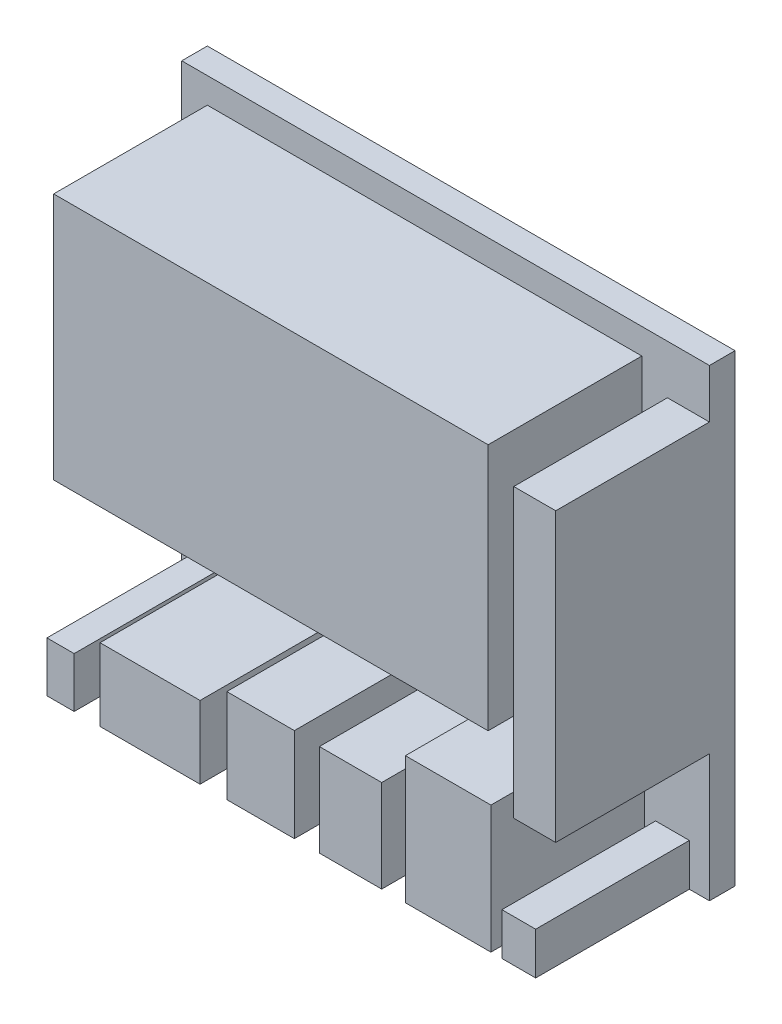
ISO-10303-21;
HEADER;
FILE_DESCRIPTION(('STEP AP214'),'2;1');
FILE_NAME('part.step','',(''),(''),'','','');
FILE_SCHEMA(('AUTOMOTIVE_DESIGN { 1 0 10303 214 1 1 1 1 }'));
ENDSEC;
DATA;
#1=APPLICATION_CONTEXT('core data for automotive mechanical design processes');
#2=APPLICATION_PROTOCOL_DEFINITION('international standard','automotive_design',2000,#1);
#3=PRODUCT_CONTEXT('',#1,'mechanical');
#4=PRODUCT('Part','Part','',(#3));
#5=PRODUCT_RELATED_PRODUCT_CATEGORY('part','',(#4));
#6=PRODUCT_DEFINITION_FORMATION('','',#4);
#7=PRODUCT_DEFINITION_CONTEXT('part definition',#1,'design');
#8=PRODUCT_DEFINITION('design','',#6,#7);
#9=PRODUCT_DEFINITION_SHAPE('','',#8);
#10=(LENGTH_UNIT() NAMED_UNIT(*) SI_UNIT(.MILLI.,.METRE.));
#11=(NAMED_UNIT(*) PLANE_ANGLE_UNIT() SI_UNIT($,.RADIAN.));
#12=(NAMED_UNIT(*) SI_UNIT($,.STERADIAN.) SOLID_ANGLE_UNIT());
#13=UNCERTAINTY_MEASURE_WITH_UNIT(LENGTH_MEASURE(1.E-05),#10,'distance_accuracy_value','');
#14=(GEOMETRIC_REPRESENTATION_CONTEXT(3) GLOBAL_UNCERTAINTY_ASSIGNED_CONTEXT((#13)) GLOBAL_UNIT_ASSIGNED_CONTEXT((#10,
#11,#12)) REPRESENTATION_CONTEXT('',''));
#15=CARTESIAN_POINT('',(0.,0.,0.));
#16=DIRECTION('',(0.,0.,1.));
#17=DIRECTION('',(1.,0.,0.));
#18=AXIS2_PLACEMENT_3D('',#15,#16,#17);
#19=CARTESIAN_POINT('',(0.,0.,35.));
#20=DIRECTION('',(1.,0.,0.));
#21=DIRECTION('',(0.,0.,-1.));
#22=AXIS2_PLACEMENT_3D('',#19,#20,#21);
#23=PLANE('',#22);
#24=DIRECTION('',(0.,-1.,0.));
#25=VECTOR('',#24,1.);
#26=CARTESIAN_POINT('',(0.,32.1447308661449,5.));
#27=LINE('',#26,#25);
#28=CARTESIAN_POINT('',(0.,90.5,5.));
#29=VERTEX_POINT('',#28);
#30=CARTESIAN_POINT('',(0.,0.,5.));
#31=VERTEX_POINT('',#30);
#32=EDGE_CURVE('E415',#29,#31,#27,.T.);
#33=ORIENTED_EDGE('',*,*,#32,.F.);
#34=DIRECTION('',(0.,0.,-1.));
#35=VECTOR('',#34,1.);
#36=CARTESIAN_POINT('',(0.,90.5,35.));
#37=LINE('',#36,#35);
#38=CARTESIAN_POINT('',(0.,90.5,0.));
#39=VERTEX_POINT('',#38);
#40=EDGE_CURVE('E534',#29,#39,#37,.T.);
#41=ORIENTED_EDGE('',*,*,#40,.T.);
#42=DIRECTION('',(0.,-1.,0.));
#43=VECTOR('',#42,1.);
#44=CARTESIAN_POINT('',(0.,0.,0.));
#45=LINE('',#44,#43);
#46=CARTESIAN_POINT('',(0.,0.,0.));
#47=VERTEX_POINT('',#46);
#48=EDGE_CURVE('E469',#39,#47,#45,.T.);
#49=ORIENTED_EDGE('',*,*,#48,.T.);
#50=DIRECTION('',(0.,0.,-1.));
#51=VECTOR('',#50,1.);
#52=CARTESIAN_POINT('',(0.,0.,35.));
#53=LINE('',#52,#51);
#54=EDGE_CURVE('E11',#31,#47,#53,.T.);
#55=ORIENTED_EDGE('',*,*,#54,.F.);
#56=EDGE_LOOP('',(#33,#41,#49,#55));
#57=FACE_BOUND('',#56,.T.);
#58=ADVANCED_FACE('F43',(#57),#23,.F.);
#59=CARTESIAN_POINT('',(0.,90.5,35.));
#60=DIRECTION('',(0.,-1.,0.));
#61=DIRECTION('',(0.,0.,-1.));
#62=AXIS2_PLACEMENT_3D('',#59,#60,#61);
#63=PLANE('',#62);
#64=DIRECTION('',(-1.,0.,0.));
#65=VECTOR('',#64,1.);
#66=CARTESIAN_POINT('',(103.,90.5,5.));
#67=LINE('',#66,#65);
#68=CARTESIAN_POINT('',(103.,90.5,5.));
#69=VERTEX_POINT('',#68);
#70=EDGE_CURVE('E316',#69,#29,#67,.T.);
#71=ORIENTED_EDGE('',*,*,#70,.F.);
#72=DIRECTION('',(0.,0.,-1.));
#73=VECTOR('',#72,1.);
#74=CARTESIAN_POINT('',(103.,90.5,35.));
#75=LINE('',#74,#73);
#76=CARTESIAN_POINT('',(103.,90.5,0.));
#77=VERTEX_POINT('',#76);
#78=EDGE_CURVE('E546',#69,#77,#75,.T.);
#79=ORIENTED_EDGE('',*,*,#78,.T.);
#80=DIRECTION('',(-1.,0.,0.));
#81=VECTOR('',#80,1.);
#82=CARTESIAN_POINT('',(0.,90.5,0.));
#83=LINE('',#82,#81);
#84=EDGE_CURVE('E529',#77,#39,#83,.T.);
#85=ORIENTED_EDGE('',*,*,#84,.T.);
#86=ORIENTED_EDGE('',*,*,#40,.F.);
#87=EDGE_LOOP('',(#71,#79,#85,#86));
#88=FACE_BOUND('',#87,.T.);
#89=ADVANCED_FACE('F569',(#88),#63,.F.);
#90=CARTESIAN_POINT('',(0.,0.,35.));
#91=DIRECTION('',(0.,0.,-1.));
#92=DIRECTION('',(-1.,0.,0.));
#93=AXIS2_PLACEMENT_3D('',#90,#91,#92);
#94=PLANE('',#93);
#95=DIRECTION('',(0.,1.,0.));
#96=VECTOR('',#95,1.);
#97=CARTESIAN_POINT('',(103.,0.,35.));
#98=LINE('',#97,#96);
#99=CARTESIAN_POINT('',(103.,24.8660172198583,35.));
#100=VERTEX_POINT('',#99);
#101=CARTESIAN_POINT('',(103.,80.9396763540743,35.));
#102=VERTEX_POINT('',#101);
#103=EDGE_CURVE('E531',#100,#102,#98,.T.);
#104=ORIENTED_EDGE('',*,*,#103,.T.);
#105=DIRECTION('',(1.,0.,0.));
#106=VECTOR('',#105,1.);
#107=CARTESIAN_POINT('',(94.8039679540252,80.9396763540743,35.));
#108=LINE('',#107,#106);
#109=CARTESIAN_POINT('',(94.8039679540252,80.9396763540743,35.));
#110=VERTEX_POINT('',#109);
#111=EDGE_CURVE('E312',#110,#102,#108,.T.);
#112=ORIENTED_EDGE('',*,*,#111,.F.);
#113=DIRECTION('',(0.,1.,0.));
#114=VECTOR('',#113,1.);
#115=CARTESIAN_POINT('',(94.8039679540252,24.8660172198583,35.));
#116=LINE('',#115,#114);
#117=CARTESIAN_POINT('',(94.8039679540252,24.8660172198583,35.));
#118=VERTEX_POINT('',#117);
#119=EDGE_CURVE('E336',#118,#110,#116,.T.);
#120=ORIENTED_EDGE('',*,*,#119,.F.);
#121=DIRECTION('',(-1.,0.,0.));
#122=VECTOR('',#121,1.);
#123=CARTESIAN_POINT('',(103.,24.8660172198583,35.));
#124=LINE('',#123,#122);
#125=EDGE_CURVE('E463',#100,#118,#124,.T.);
#126=ORIENTED_EDGE('',*,*,#125,.F.);
#127=EDGE_LOOP('',(#104,#112,#120,#126));
#128=FACE_BOUND('',#127,.T.);
#129=ADVANCED_FACE('F580',(#128),#94,.F.);
#130=DIRECTION('',(1.,0.,0.));
#131=VECTOR('',#130,1.);
#132=CARTESIAN_POINT('',(0.,0.,35.));
#133=LINE('',#132,#131);
#134=CARTESIAN_POINT('',(92.4919059722635,0.,35.));
#135=VERTEX_POINT('',#134);
#136=CARTESIAN_POINT('',(99.0855642165467,0.,35.));
#137=VERTEX_POINT('',#136);
#138=EDGE_CURVE('E525',#135,#137,#133,.T.);
#139=ORIENTED_EDGE('',*,*,#138,.T.);
#140=DIRECTION('',(0.,-1.,0.));
#141=VECTOR('',#140,1.);
#142=CARTESIAN_POINT('',(99.0855642165467,8.25342372127454,35.));
#143=LINE('',#142,#141);
#144=CARTESIAN_POINT('',(99.0855642165467,8.25342372127454,35.));
#145=VERTEX_POINT('',#144);
#146=EDGE_CURVE('E461',#145,#137,#143,.T.);
#147=ORIENTED_EDGE('',*,*,#146,.F.);
#148=DIRECTION('',(1.,0.,0.));
#149=VECTOR('',#148,1.);
#150=CARTESIAN_POINT('',(92.4919059722635,8.25342372127454,35.));
#151=LINE('',#150,#149);
#152=CARTESIAN_POINT('',(92.4919059722635,8.25342372127454,35.));
#153=VERTEX_POINT('',#152);
#154=EDGE_CURVE('E458',#153,#145,#151,.T.);
#155=ORIENTED_EDGE('',*,*,#154,.F.);
#156=DIRECTION('',(0.,1.,0.));
#157=VECTOR('',#156,1.);
#158=CARTESIAN_POINT('',(92.4919059722635,0.,35.));
#159=LINE('',#158,#157);
#160=EDGE_CURVE('E455',#135,#153,#159,.T.);
#161=ORIENTED_EDGE('',*,*,#160,.F.);
#162=EDGE_LOOP('',(#139,#147,#155,#161));
#163=FACE_BOUND('',#162,.T.);
#164=ADVANCED_FACE('F591',(#163),#94,.F.);
#165=CARTESIAN_POINT('',(73.6528824171685,0.,35.));
#166=VERTEX_POINT('',#165);
#167=CARTESIAN_POINT('',(90.3511078410027,0.,35.));
#168=VERTEX_POINT('',#167);
#169=EDGE_CURVE('E528',#166,#168,#133,.T.);
#170=ORIENTED_EDGE('',*,*,#169,.T.);
#171=DIRECTION('',(0.,-1.,0.));
#172=VECTOR('',#171,1.);
#173=CARTESIAN_POINT('',(90.3511078410027,24.8660172198583,35.));
#174=LINE('',#173,#172);
#175=CARTESIAN_POINT('',(90.3511078410027,24.8660172198583,35.));
#176=VERTEX_POINT('',#175);
#177=EDGE_CURVE('E453',#176,#168,#174,.T.);
#178=ORIENTED_EDGE('',*,*,#177,.F.);
#179=DIRECTION('',(1.,0.,0.));
#180=VECTOR('',#179,1.);
#181=CARTESIAN_POINT('',(73.6528824171685,24.8660172198583,35.));
#182=LINE('',#181,#180);
#183=CARTESIAN_POINT('',(73.6528824171685,24.8660172198583,35.));
#184=VERTEX_POINT('',#183);
#185=EDGE_CURVE('E450',#184,#176,#182,.T.);
#186=ORIENTED_EDGE('',*,*,#185,.F.);
#187=DIRECTION('',(0.,1.,0.));
#188=VECTOR('',#187,1.);
#189=CARTESIAN_POINT('',(73.6528824171685,0.,35.));
#190=LINE('',#189,#188);
#191=EDGE_CURVE('E447',#166,#184,#190,.T.);
#192=ORIENTED_EDGE('',*,*,#191,.F.);
#193=EDGE_LOOP('',(#170,#178,#186,#192));
#194=FACE_BOUND('',#193,.T.);
#195=ADVANCED_FACE('F606',(#194),#94,.F.);
#196=CARTESIAN_POINT('',(56.8690250680839,0.,35.));
#197=VERTEX_POINT('',#196);
#198=CARTESIAN_POINT('',(69.0287584536452,0.,35.));
#199=VERTEX_POINT('',#198);
#200=EDGE_CURVE('E609',#197,#199,#133,.T.);
#201=ORIENTED_EDGE('',*,*,#200,.T.);
#202=DIRECTION('',(0.,-1.,0.));
#203=VECTOR('',#202,1.);
#204=CARTESIAN_POINT('',(69.0287584536452,18.0154631998237,35.));
#205=LINE('',#204,#203);
#206=CARTESIAN_POINT('',(69.0287584536452,18.0154631998237,35.));
#207=VERTEX_POINT('',#206);
#208=EDGE_CURVE('E445',#207,#199,#205,.T.);
#209=ORIENTED_EDGE('',*,*,#208,.F.);
#210=DIRECTION('',(1.,0.,0.));
#211=VECTOR('',#210,1.);
#212=CARTESIAN_POINT('',(56.8690250680839,18.0154631998237,35.));
#213=LINE('',#212,#211);
#214=CARTESIAN_POINT('',(56.8690250680839,18.0154631998237,35.));
#215=VERTEX_POINT('',#214);
#216=EDGE_CURVE('E442',#215,#207,#213,.T.);
#217=ORIENTED_EDGE('',*,*,#216,.F.);
#218=DIRECTION('',(0.,1.,0.));
#219=VECTOR('',#218,1.);
#220=CARTESIAN_POINT('',(56.8690250680839,0.,35.));
#221=LINE('',#220,#219);
#222=EDGE_CURVE('E439',#197,#215,#221,.T.);
#223=ORIENTED_EDGE('',*,*,#222,.F.);
#224=EDGE_LOOP('',(#201,#209,#217,#223));
#225=FACE_BOUND('',#224,.T.);
#226=ADVANCED_FACE('F673',(#225),#94,.F.);
#227=CARTESIAN_POINT('',(38.8006888402429,0.,35.));
#228=VERTEX_POINT('',#227);
#229=CARTESIAN_POINT('',(51.9880053288093,0.,35.));
#230=VERTEX_POINT('',#229);
#231=EDGE_CURVE('E611',#228,#230,#133,.T.);
#232=ORIENTED_EDGE('',*,*,#231,.T.);
#233=DIRECTION('',(0.,-1.,0.));
#234=VECTOR('',#233,1.);
#235=CARTESIAN_POINT('',(51.9880053288093,18.272358975575,35.));
#236=LINE('',#235,#234);
#237=CARTESIAN_POINT('',(51.9880053288093,18.272358975575,35.));
#238=VERTEX_POINT('',#237);
#239=EDGE_CURVE('E437',#238,#230,#236,.T.);
#240=ORIENTED_EDGE('',*,*,#239,.F.);
#241=DIRECTION('',(1.,0.,0.));
#242=VECTOR('',#241,1.);
#243=CARTESIAN_POINT('',(38.8006888402429,18.272358975575,35.));
#244=LINE('',#243,#242);
#245=CARTESIAN_POINT('',(38.8006888402429,18.272358975575,35.));
#246=VERTEX_POINT('',#245);
#247=EDGE_CURVE('E434',#246,#238,#244,.T.);
#248=ORIENTED_EDGE('',*,*,#247,.F.);
#249=DIRECTION('',(0.,1.,0.));
#250=VECTOR('',#249,1.);
#251=CARTESIAN_POINT('',(38.8006888402429,0.,35.));
#252=LINE('',#251,#250);
#253=EDGE_CURVE('E431',#228,#246,#252,.T.);
#254=ORIENTED_EDGE('',*,*,#253,.F.);
#255=EDGE_LOOP('',(#232,#240,#248,#254));
#256=FACE_BOUND('',#255,.T.);
#257=ADVANCED_FACE('F669',(#256),#94,.F.);
#258=CARTESIAN_POINT('',(14.0530624428681,0.,35.));
#259=VERTEX_POINT('',#258);
#260=CARTESIAN_POINT('',(33.5771413999665,0.,35.));
#261=VERTEX_POINT('',#260);
#262=EDGE_CURVE('E617',#259,#261,#133,.T.);
#263=ORIENTED_EDGE('',*,*,#262,.T.);
#264=DIRECTION('',(0.,-1.,0.));
#265=VECTOR('',#264,1.);
#266=CARTESIAN_POINT('',(33.5771413999665,14.1620265635543,35.));
#267=LINE('',#266,#265);
#268=CARTESIAN_POINT('',(33.5771413999665,14.1620265635543,35.));
#269=VERTEX_POINT('',#268);
#270=EDGE_CURVE('E429',#269,#261,#267,.T.);
#271=ORIENTED_EDGE('',*,*,#270,.F.);
#272=DIRECTION('',(1.,0.,0.));
#273=VECTOR('',#272,1.);
#274=CARTESIAN_POINT('',(14.0530624428681,14.1620265635543,35.));
#275=LINE('',#274,#273);
#276=CARTESIAN_POINT('',(14.0530624428681,14.1620265635543,35.));
#277=VERTEX_POINT('',#276);
#278=EDGE_CURVE('E426',#277,#269,#275,.T.);
#279=ORIENTED_EDGE('',*,*,#278,.F.);
#280=DIRECTION('',(0.,1.,0.));
#281=VECTOR('',#280,1.);
#282=CARTESIAN_POINT('',(14.0530624428681,0.,35.));
#283=LINE('',#282,#281);
#284=EDGE_CURVE('E423',#259,#277,#283,.T.);
#285=ORIENTED_EDGE('',*,*,#284,.F.);
#286=EDGE_LOOP('',(#263,#271,#279,#285));
#287=FACE_BOUND('',#286,.T.);
#288=ADVANCED_FACE('F664',(#287),#94,.F.);
#289=CARTESIAN_POINT('',(0.,0.,35.));
#290=DIRECTION('',(0.,1.,0.));
#291=DIRECTION('',(0.,0.,1.));
#292=AXIS2_PLACEMENT_3D('',#289,#290,#291);
#293=PLANE('',#292);
#294=CARTESIAN_POINT('',(3.69159948756589,0.,35.));
#295=VERTEX_POINT('',#294);
#296=CARTESIAN_POINT('',(9.00077885309267,0.,35.));
#297=VERTEX_POINT('',#296);
#298=EDGE_CURVE('E530',#295,#297,#133,.T.);
#299=ORIENTED_EDGE('',*,*,#298,.F.);
#300=DIRECTION('',(0.,0.,1.));
#301=VECTOR('',#300,1.);
#302=CARTESIAN_POINT('',(3.69159948756589,0.,5.));
#303=LINE('',#302,#301);
#304=CARTESIAN_POINT('',(3.69159948756589,0.,5.));
#305=VERTEX_POINT('',#304);
#306=EDGE_CURVE('E65',#305,#295,#303,.T.);
#307=ORIENTED_EDGE('',*,*,#306,.F.);
#308=DIRECTION('',(1.,0.,0.));
#309=VECTOR('',#308,1.);
#310=CARTESIAN_POINT('',(0.,0.,5.));
#311=LINE('',#310,#309);
#312=EDGE_CURVE('E332',#31,#305,#311,.T.);
#313=ORIENTED_EDGE('',*,*,#312,.F.);
#314=ORIENTED_EDGE('',*,*,#54,.T.);
#315=DIRECTION('',(1.,0.,0.));
#316=VECTOR('',#315,1.);
#317=CARTESIAN_POINT('',(0.,0.,0.));
#318=LINE('',#317,#316);
#319=CARTESIAN_POINT('',(103.,0.,0.));
#320=VERTEX_POINT('',#319);
#321=EDGE_CURVE('E537',#47,#320,#318,.T.);
#322=ORIENTED_EDGE('',*,*,#321,.T.);
#323=DIRECTION('',(0.,0.,-1.));
#324=VECTOR('',#323,1.);
#325=CARTESIAN_POINT('',(103.,0.,35.));
#326=LINE('',#325,#324);
#327=CARTESIAN_POINT('',(103.,0.,5.));
#328=VERTEX_POINT('',#327);
#329=EDGE_CURVE('E50',#328,#320,#326,.T.);
#330=ORIENTED_EDGE('',*,*,#329,.F.);
#331=DIRECTION('',(1.,0.,0.));
#332=VECTOR('',#331,1.);
#333=CARTESIAN_POINT('',(99.0855642165467,0.,5.));
#334=LINE('',#333,#332);
#335=CARTESIAN_POINT('',(99.0855642165467,0.,5.));
#336=VERTEX_POINT('',#335);
#337=EDGE_CURVE('E405',#336,#328,#334,.T.);
#338=ORIENTED_EDGE('',*,*,#337,.F.);
#339=DIRECTION('',(0.,0.,1.));
#340=VECTOR('',#339,1.);
#341=CARTESIAN_POINT('',(99.0855642165467,0.,5.));
#342=LINE('',#341,#340);
#343=EDGE_CURVE('E472',#336,#137,#342,.T.);
#344=ORIENTED_EDGE('',*,*,#343,.T.);
#345=ORIENTED_EDGE('',*,*,#138,.F.);
#346=DIRECTION('',(0.,0.,1.));
#347=VECTOR('',#346,1.);
#348=CARTESIAN_POINT('',(92.4919059722635,0.,5.));
#349=LINE('',#348,#347);
#350=CARTESIAN_POINT('',(92.4919059722635,0.,5.));
#351=VERTEX_POINT('',#350);
#352=EDGE_CURVE('E479',#351,#135,#349,.T.);
#353=ORIENTED_EDGE('',*,*,#352,.F.);
#354=DIRECTION('',(1.,0.,0.));
#355=VECTOR('',#354,1.);
#356=CARTESIAN_POINT('',(90.3511078410027,0.,5.));
#357=LINE('',#356,#355);
#358=CARTESIAN_POINT('',(90.3511078410027,0.,5.));
#359=VERTEX_POINT('',#358);
#360=EDGE_CURVE('E393',#359,#351,#357,.T.);
#361=ORIENTED_EDGE('',*,*,#360,.F.);
#362=DIRECTION('',(0.,0.,1.));
#363=VECTOR('',#362,1.);
#364=CARTESIAN_POINT('',(90.3511078410027,0.,5.));
#365=LINE('',#364,#363);
#366=EDGE_CURVE('E481',#359,#168,#365,.T.);
#367=ORIENTED_EDGE('',*,*,#366,.T.);
#368=ORIENTED_EDGE('',*,*,#169,.F.);
#369=DIRECTION('',(0.,0.,1.));
#370=VECTOR('',#369,1.);
#371=CARTESIAN_POINT('',(73.6528824171685,0.,5.));
#372=LINE('',#371,#370);
#373=CARTESIAN_POINT('',(73.6528824171685,0.,5.));
#374=VERTEX_POINT('',#373);
#375=EDGE_CURVE('E488',#374,#166,#372,.T.);
#376=ORIENTED_EDGE('',*,*,#375,.F.);
#377=DIRECTION('',(1.,0.,0.));
#378=VECTOR('',#377,1.);
#379=CARTESIAN_POINT('',(69.0287584536452,0.,5.));
#380=LINE('',#379,#378);
#381=CARTESIAN_POINT('',(69.0287584536452,0.,5.));
#382=VERTEX_POINT('',#381);
#383=EDGE_CURVE('E381',#382,#374,#380,.T.);
#384=ORIENTED_EDGE('',*,*,#383,.F.);
#385=DIRECTION('',(0.,0.,1.));
#386=VECTOR('',#385,1.);
#387=CARTESIAN_POINT('',(69.0287584536452,0.,5.));
#388=LINE('',#387,#386);
#389=EDGE_CURVE('E490',#382,#199,#388,.T.);
#390=ORIENTED_EDGE('',*,*,#389,.T.);
#391=ORIENTED_EDGE('',*,*,#200,.F.);
#392=DIRECTION('',(0.,0.,1.));
#393=VECTOR('',#392,1.);
#394=CARTESIAN_POINT('',(56.8690250680839,0.,5.));
#395=LINE('',#394,#393);
#396=CARTESIAN_POINT('',(56.8690250680839,0.,5.));
#397=VERTEX_POINT('',#396);
#398=EDGE_CURVE('E497',#397,#197,#395,.T.);
#399=ORIENTED_EDGE('',*,*,#398,.F.);
#400=DIRECTION('',(1.,0.,0.));
#401=VECTOR('',#400,1.);
#402=CARTESIAN_POINT('',(51.9880053288093,0.,5.));
#403=LINE('',#402,#401);
#404=CARTESIAN_POINT('',(51.9880053288093,0.,5.));
#405=VERTEX_POINT('',#404);
#406=EDGE_CURVE('E369',#405,#397,#403,.T.);
#407=ORIENTED_EDGE('',*,*,#406,.F.);
#408=DIRECTION('',(0.,0.,1.));
#409=VECTOR('',#408,1.);
#410=CARTESIAN_POINT('',(51.9880053288093,0.,5.));
#411=LINE('',#410,#409);
#412=EDGE_CURVE('E499',#405,#230,#411,.T.);
#413=ORIENTED_EDGE('',*,*,#412,.T.);
#414=ORIENTED_EDGE('',*,*,#231,.F.);
#415=DIRECTION('',(0.,0.,1.));
#416=VECTOR('',#415,1.);
#417=CARTESIAN_POINT('',(38.8006888402429,0.,5.));
#418=LINE('',#417,#416);
#419=CARTESIAN_POINT('',(38.8006888402429,0.,5.));
#420=VERTEX_POINT('',#419);
#421=EDGE_CURVE('E506',#420,#228,#418,.T.);
#422=ORIENTED_EDGE('',*,*,#421,.F.);
#423=DIRECTION('',(1.,0.,0.));
#424=VECTOR('',#423,1.);
#425=CARTESIAN_POINT('',(33.5771413999665,0.,5.));
#426=LINE('',#425,#424);
#427=CARTESIAN_POINT('',(33.5771413999665,0.,5.));
#428=VERTEX_POINT('',#427);
#429=EDGE_CURVE('E357',#428,#420,#426,.T.);
#430=ORIENTED_EDGE('',*,*,#429,.F.);
#431=DIRECTION('',(0.,0.,1.));
#432=VECTOR('',#431,1.);
#433=CARTESIAN_POINT('',(33.5771413999665,0.,5.));
#434=LINE('',#433,#432);
#435=EDGE_CURVE('E508',#428,#261,#434,.T.);
#436=ORIENTED_EDGE('',*,*,#435,.T.);
#437=ORIENTED_EDGE('',*,*,#262,.F.);
#438=DIRECTION('',(0.,0.,1.));
#439=VECTOR('',#438,1.);
#440=CARTESIAN_POINT('',(14.0530624428681,0.,5.));
#441=LINE('',#440,#439);
#442=CARTESIAN_POINT('',(14.0530624428681,0.,5.));
#443=VERTEX_POINT('',#442);
#444=EDGE_CURVE('E515',#443,#259,#441,.T.);
#445=ORIENTED_EDGE('',*,*,#444,.F.);
#446=DIRECTION('',(1.,0.,0.));
#447=VECTOR('',#446,1.);
#448=CARTESIAN_POINT('',(9.00077885309267,0.,5.));
#449=LINE('',#448,#447);
#450=CARTESIAN_POINT('',(9.00077885309267,0.,5.));
#451=VERTEX_POINT('',#450);
#452=EDGE_CURVE('E345',#451,#443,#449,.T.);
#453=ORIENTED_EDGE('',*,*,#452,.F.);
#454=DIRECTION('',(0.,0.,1.));
#455=VECTOR('',#454,1.);
#456=CARTESIAN_POINT('',(9.00077885309267,0.,5.));
#457=LINE('',#456,#455);
#458=EDGE_CURVE('E517',#451,#297,#457,.T.);
#459=ORIENTED_EDGE('',*,*,#458,.T.);
#460=EDGE_LOOP('',(#299,#307,#313,#314,#322,#330,#338,#344,#345,#353,#361,#367,#368,#376,#384,
#390,#391,#399,#407,#413,#414,#422,#430,#436,#437,#445,#453,#459));
#461=FACE_BOUND('',#460,.T.);
#462=ADVANCED_FACE('F560',(#461),#293,.F.);
#463=CARTESIAN_POINT('',(103.,0.,35.));
#464=DIRECTION('',(-1.,0.,0.));
#465=DIRECTION('',(0.,0.,1.));
#466=AXIS2_PLACEMENT_3D('',#463,#464,#465);
#467=PLANE('',#466);
#468=DIRECTION('',(0.,1.,0.));
#469=VECTOR('',#468,1.);
#470=CARTESIAN_POINT('',(103.,80.9396763540743,5.));
#471=LINE('',#470,#469);
#472=CARTESIAN_POINT('',(103.,80.9396763540743,5.));
#473=VERTEX_POINT('',#472);
#474=EDGE_CURVE('E322',#473,#69,#471,.T.);
#475=ORIENTED_EDGE('',*,*,#474,.F.);
#476=DIRECTION('',(0.,0.,1.));
#477=VECTOR('',#476,1.);
#478=CARTESIAN_POINT('',(103.,80.9396763540743,5.));
#479=LINE('',#478,#477);
#480=EDGE_CURVE('E326',#473,#102,#479,.T.);
#481=ORIENTED_EDGE('',*,*,#480,.T.);
#482=ORIENTED_EDGE('',*,*,#103,.F.);
#483=DIRECTION('',(0.,0.,1.));
#484=VECTOR('',#483,1.);
#485=CARTESIAN_POINT('',(103.,24.8660172198583,5.));
#486=LINE('',#485,#484);
#487=CARTESIAN_POINT('',(103.,24.8660172198583,5.));
#488=VERTEX_POINT('',#487);
#489=EDGE_CURVE('E470',#488,#100,#486,.T.);
#490=ORIENTED_EDGE('',*,*,#489,.F.);
#491=DIRECTION('',(0.,1.,0.));
#492=VECTOR('',#491,1.);
#493=CARTESIAN_POINT('',(103.,0.,5.));
#494=LINE('',#493,#492);
#495=EDGE_CURVE('E407',#328,#488,#494,.T.);
#496=ORIENTED_EDGE('',*,*,#495,.F.);
#497=ORIENTED_EDGE('',*,*,#329,.T.);
#498=DIRECTION('',(0.,1.,0.));
#499=VECTOR('',#498,1.);
#500=CARTESIAN_POINT('',(103.,0.,0.));
#501=LINE('',#500,#499);
#502=EDGE_CURVE('E540',#320,#77,#501,.T.);
#503=ORIENTED_EDGE('',*,*,#502,.T.);
#504=ORIENTED_EDGE('',*,*,#78,.F.);
#505=EDGE_LOOP('',(#475,#481,#482,#490,#496,#497,#503,#504));
#506=FACE_BOUND('',#505,.T.);
#507=ADVANCED_FACE('F551',(#506),#467,.F.);
#508=ORIENTED_EDGE('',*,*,#298,.T.);
#509=DIRECTION('',(0.,-1.,0.));
#510=VECTOR('',#509,1.);
#511=CARTESIAN_POINT('',(9.00077885309267,9.79479837578231,35.));
#512=LINE('',#511,#510);
#513=CARTESIAN_POINT('',(9.00077885309267,9.79479837578231,35.));
#514=VERTEX_POINT('',#513);
#515=EDGE_CURVE('E421',#514,#297,#512,.T.);
#516=ORIENTED_EDGE('',*,*,#515,.F.);
#517=DIRECTION('',(1.,0.,0.));
#518=VECTOR('',#517,1.);
#519=CARTESIAN_POINT('',(3.69159948756589,9.79479837578231,35.));
#520=LINE('',#519,#518);
#521=CARTESIAN_POINT('',(3.69159948756589,9.79479837578231,35.));
#522=VERTEX_POINT('',#521);
#523=EDGE_CURVE('E418',#522,#514,#520,.T.);
#524=ORIENTED_EDGE('',*,*,#523,.F.);
#525=DIRECTION('',(0.,1.,0.));
#526=VECTOR('',#525,1.);
#527=CARTESIAN_POINT('',(3.69159948756589,0.,35.));
#528=LINE('',#527,#526);
#529=EDGE_CURVE('E329',#295,#522,#528,.T.);
#530=ORIENTED_EDGE('',*,*,#529,.F.);
#531=EDGE_LOOP('',(#508,#516,#524,#530));
#532=FACE_BOUND('',#531,.T.);
#533=ADVANCED_FACE('F630',(#532),#94,.F.);
#534=CARTESIAN_POINT('',(0.,0.,0.));
#535=DIRECTION('',(0.,0.,-1.));
#536=DIRECTION('',(-1.,0.,0.));
#537=AXIS2_PLACEMENT_3D('',#534,#535,#536);
#538=PLANE('',#537);
#539=ORIENTED_EDGE('',*,*,#48,.F.);
#540=ORIENTED_EDGE('',*,*,#84,.F.);
#541=ORIENTED_EDGE('',*,*,#502,.F.);
#542=ORIENTED_EDGE('',*,*,#321,.F.);
#543=EDGE_LOOP('',(#539,#540,#541,#542));
#544=FACE_BOUND('',#543,.T.);
#545=ADVANCED_FACE('F565',(#544),#538,.T.);
#546=CARTESIAN_POINT('',(94.8039679540252,24.8660172198583,5.));
#547=DIRECTION('',(1.,0.,0.));
#548=DIRECTION('',(0.,0.,-1.));
#549=AXIS2_PLACEMENT_3D('',#546,#547,#548);
#550=PLANE('',#549);
#551=ORIENTED_EDGE('',*,*,#119,.T.);
#552=DIRECTION('',(0.,0.,1.));
#553=VECTOR('',#552,1.);
#554=CARTESIAN_POINT('',(94.8039679540252,80.9396763540743,5.));
#555=LINE('',#554,#553);
#556=CARTESIAN_POINT('',(94.8039679540252,80.9396763540743,5.));
#557=VERTEX_POINT('',#556);
#558=EDGE_CURVE('E324',#557,#110,#555,.T.);
#559=ORIENTED_EDGE('',*,*,#558,.F.);
#560=DIRECTION('',(0.,1.,0.));
#561=VECTOR('',#560,1.);
#562=CARTESIAN_POINT('',(94.8039679540252,24.8660172198583,5.));
#563=LINE('',#562,#561);
#564=CARTESIAN_POINT('',(94.8039679540252,24.8660172198583,5.));
#565=VERTEX_POINT('',#564);
#566=EDGE_CURVE('E413',#565,#557,#563,.T.);
#567=ORIENTED_EDGE('',*,*,#566,.F.);
#568=DIRECTION('',(0.,0.,1.));
#569=VECTOR('',#568,1.);
#570=CARTESIAN_POINT('',(94.8039679540252,24.8660172198583,5.));
#571=LINE('',#570,#569);
#572=EDGE_CURVE('E467',#565,#118,#571,.T.);
#573=ORIENTED_EDGE('',*,*,#572,.T.);
#574=EDGE_LOOP('',(#551,#559,#567,#573));
#575=FACE_BOUND('',#574,.T.);
#576=ADVANCED_FACE('F678',(#575),#550,.F.);
#577=CARTESIAN_POINT('',(103.,24.8660172198583,5.));
#578=DIRECTION('',(0.,1.,0.));
#579=DIRECTION('',(0.,0.,1.));
#580=AXIS2_PLACEMENT_3D('',#577,#578,#579);
#581=PLANE('',#580);
#582=ORIENTED_EDGE('',*,*,#125,.T.);
#583=ORIENTED_EDGE('',*,*,#572,.F.);
#584=DIRECTION('',(-1.,0.,0.));
#585=VECTOR('',#584,1.);
#586=CARTESIAN_POINT('',(103.,24.8660172198583,5.));
#587=LINE('',#586,#585);
#588=EDGE_CURVE('E410',#488,#565,#587,.T.);
#589=ORIENTED_EDGE('',*,*,#588,.F.);
#590=ORIENTED_EDGE('',*,*,#489,.T.);
#591=EDGE_LOOP('',(#582,#583,#589,#590));
#592=FACE_BOUND('',#591,.T.);
#593=ADVANCED_FACE('F583',(#592),#581,.F.);
#594=CARTESIAN_POINT('',(99.0855642165467,8.25342372127454,5.));
#595=DIRECTION('',(-1.,0.,0.));
#596=DIRECTION('',(0.,0.,1.));
#597=AXIS2_PLACEMENT_3D('',#594,#595,#596);
#598=PLANE('',#597);
#599=ORIENTED_EDGE('',*,*,#146,.T.);
#600=ORIENTED_EDGE('',*,*,#343,.F.);
#601=DIRECTION('',(0.,-1.,0.));
#602=VECTOR('',#601,1.);
#603=CARTESIAN_POINT('',(99.0855642165467,8.25342372127454,5.));
#604=LINE('',#603,#602);
#605=CARTESIAN_POINT('',(99.0855642165467,8.25342372127454,5.));
#606=VERTEX_POINT('',#605);
#607=EDGE_CURVE('E402',#606,#336,#604,.T.);
#608=ORIENTED_EDGE('',*,*,#607,.F.);
#609=DIRECTION('',(0.,0.,1.));
#610=VECTOR('',#609,1.);
#611=CARTESIAN_POINT('',(99.0855642165467,8.25342372127454,5.));
#612=LINE('',#611,#610);
#613=EDGE_CURVE('E475',#606,#145,#612,.T.);
#614=ORIENTED_EDGE('',*,*,#613,.T.);
#615=EDGE_LOOP('',(#599,#600,#608,#614));
#616=FACE_BOUND('',#615,.T.);
#617=ADVANCED_FACE('F704',(#616),#598,.F.);
#618=CARTESIAN_POINT('',(92.4919059722635,8.25342372127454,5.));
#619=DIRECTION('',(0.,-1.,0.));
#620=DIRECTION('',(0.,0.,-1.));
#621=AXIS2_PLACEMENT_3D('',#618,#619,#620);
#622=PLANE('',#621);
#623=ORIENTED_EDGE('',*,*,#154,.T.);
#624=ORIENTED_EDGE('',*,*,#613,.F.);
#625=DIRECTION('',(1.,0.,0.));
#626=VECTOR('',#625,1.);
#627=CARTESIAN_POINT('',(92.4919059722635,8.25342372127454,5.));
#628=LINE('',#627,#626);
#629=CARTESIAN_POINT('',(92.4919059722635,8.25342372127454,5.));
#630=VERTEX_POINT('',#629);
#631=EDGE_CURVE('E399',#630,#606,#628,.T.);
#632=ORIENTED_EDGE('',*,*,#631,.F.);
#633=DIRECTION('',(0.,0.,1.));
#634=VECTOR('',#633,1.);
#635=CARTESIAN_POINT('',(92.4919059722635,8.25342372127454,5.));
#636=LINE('',#635,#634);
#637=EDGE_CURVE('E477',#630,#153,#636,.T.);
#638=ORIENTED_EDGE('',*,*,#637,.T.);
#639=EDGE_LOOP('',(#623,#624,#632,#638));
#640=FACE_BOUND('',#639,.T.);
#641=ADVANCED_FACE('F707',(#640),#622,.F.);
#642=CARTESIAN_POINT('',(92.4919059722635,0.,5.));
#643=DIRECTION('',(1.,0.,0.));
#644=DIRECTION('',(0.,0.,-1.));
#645=AXIS2_PLACEMENT_3D('',#642,#643,#644);
#646=PLANE('',#645);
#647=ORIENTED_EDGE('',*,*,#160,.T.);
#648=ORIENTED_EDGE('',*,*,#637,.F.);
#649=DIRECTION('',(0.,1.,0.));
#650=VECTOR('',#649,1.);
#651=CARTESIAN_POINT('',(92.4919059722635,0.,5.));
#652=LINE('',#651,#650);
#653=EDGE_CURVE('E396',#351,#630,#652,.T.);
#654=ORIENTED_EDGE('',*,*,#653,.F.);
#655=ORIENTED_EDGE('',*,*,#352,.T.);
#656=EDGE_LOOP('',(#647,#648,#654,#655));
#657=FACE_BOUND('',#656,.T.);
#658=ADVANCED_FACE('F594',(#657),#646,.F.);
#659=CARTESIAN_POINT('',(90.3511078410027,24.8660172198583,5.));
#660=DIRECTION('',(-1.,0.,0.));
#661=DIRECTION('',(0.,0.,1.));
#662=AXIS2_PLACEMENT_3D('',#659,#660,#661);
#663=PLANE('',#662);
#664=ORIENTED_EDGE('',*,*,#177,.T.);
#665=ORIENTED_EDGE('',*,*,#366,.F.);
#666=DIRECTION('',(0.,-1.,0.));
#667=VECTOR('',#666,1.);
#668=CARTESIAN_POINT('',(90.3511078410027,24.8660172198583,5.));
#669=LINE('',#668,#667);
#670=CARTESIAN_POINT('',(90.3511078410027,24.8660172198583,5.));
#671=VERTEX_POINT('',#670);
#672=EDGE_CURVE('E390',#671,#359,#669,.T.);
#673=ORIENTED_EDGE('',*,*,#672,.F.);
#674=DIRECTION('',(0.,0.,1.));
#675=VECTOR('',#674,1.);
#676=CARTESIAN_POINT('',(90.3511078410027,24.8660172198583,5.));
#677=LINE('',#676,#675);
#678=EDGE_CURVE('E484',#671,#176,#677,.T.);
#679=ORIENTED_EDGE('',*,*,#678,.T.);
#680=EDGE_LOOP('',(#664,#665,#673,#679));
#681=FACE_BOUND('',#680,.T.);
#682=ADVANCED_FACE('F602',(#681),#663,.F.);
#683=CARTESIAN_POINT('',(73.6528824171685,24.8660172198583,5.));
#684=DIRECTION('',(0.,-1.,0.));
#685=DIRECTION('',(0.,0.,-1.));
#686=AXIS2_PLACEMENT_3D('',#683,#684,#685);
#687=PLANE('',#686);
#688=ORIENTED_EDGE('',*,*,#185,.T.);
#689=ORIENTED_EDGE('',*,*,#678,.F.);
#690=DIRECTION('',(1.,0.,0.));
#691=VECTOR('',#690,1.);
#692=CARTESIAN_POINT('',(73.6528824171685,24.8660172198583,5.));
#693=LINE('',#692,#691);
#694=CARTESIAN_POINT('',(73.6528824171685,24.8660172198583,5.));
#695=VERTEX_POINT('',#694);
#696=EDGE_CURVE('E387',#695,#671,#693,.T.);
#697=ORIENTED_EDGE('',*,*,#696,.F.);
#698=DIRECTION('',(0.,0.,1.));
#699=VECTOR('',#698,1.);
#700=CARTESIAN_POINT('',(73.6528824171685,24.8660172198583,5.));
#701=LINE('',#700,#699);
#702=EDGE_CURVE('E486',#695,#184,#701,.T.);
#703=ORIENTED_EDGE('',*,*,#702,.T.);
#704=EDGE_LOOP('',(#688,#689,#697,#703));
#705=FACE_BOUND('',#704,.T.);
#706=ADVANCED_FACE('F715',(#705),#687,.F.);
#707=CARTESIAN_POINT('',(73.6528824171685,0.,5.));
#708=DIRECTION('',(1.,0.,0.));
#709=DIRECTION('',(0.,0.,-1.));
#710=AXIS2_PLACEMENT_3D('',#707,#708,#709);
#711=PLANE('',#710);
#712=ORIENTED_EDGE('',*,*,#191,.T.);
#713=ORIENTED_EDGE('',*,*,#702,.F.);
#714=DIRECTION('',(0.,1.,0.));
#715=VECTOR('',#714,1.);
#716=CARTESIAN_POINT('',(73.6528824171685,0.,5.));
#717=LINE('',#716,#715);
#718=EDGE_CURVE('E384',#374,#695,#717,.T.);
#719=ORIENTED_EDGE('',*,*,#718,.F.);
#720=ORIENTED_EDGE('',*,*,#375,.T.);
#721=EDGE_LOOP('',(#712,#713,#719,#720));
#722=FACE_BOUND('',#721,.T.);
#723=ADVANCED_FACE('F718',(#722),#711,.F.);
#724=CARTESIAN_POINT('',(69.0287584536452,18.0154631998237,5.));
#725=DIRECTION('',(-1.,0.,0.));
#726=DIRECTION('',(0.,0.,1.));
#727=AXIS2_PLACEMENT_3D('',#724,#725,#726);
#728=PLANE('',#727);
#729=ORIENTED_EDGE('',*,*,#208,.T.);
#730=ORIENTED_EDGE('',*,*,#389,.F.);
#731=DIRECTION('',(0.,-1.,0.));
#732=VECTOR('',#731,1.);
#733=CARTESIAN_POINT('',(69.0287584536452,18.0154631998237,5.));
#734=LINE('',#733,#732);
#735=CARTESIAN_POINT('',(69.0287584536452,18.0154631998237,5.));
#736=VERTEX_POINT('',#735);
#737=EDGE_CURVE('E378',#736,#382,#734,.T.);
#738=ORIENTED_EDGE('',*,*,#737,.F.);
#739=DIRECTION('',(0.,0.,1.));
#740=VECTOR('',#739,1.);
#741=CARTESIAN_POINT('',(69.0287584536452,18.0154631998237,5.));
#742=LINE('',#741,#740);
#743=EDGE_CURVE('E493',#736,#207,#742,.T.);
#744=ORIENTED_EDGE('',*,*,#743,.T.);
#745=EDGE_LOOP('',(#729,#730,#738,#744));
#746=FACE_BOUND('',#745,.T.);
#747=ADVANCED_FACE('F722',(#746),#728,.F.);
#748=CARTESIAN_POINT('',(56.8690250680839,18.0154631998237,5.));
#749=DIRECTION('',(0.,-1.,0.));
#750=DIRECTION('',(0.,0.,-1.));
#751=AXIS2_PLACEMENT_3D('',#748,#749,#750);
#752=PLANE('',#751);
#753=ORIENTED_EDGE('',*,*,#216,.T.);
#754=ORIENTED_EDGE('',*,*,#743,.F.);
#755=DIRECTION('',(1.,0.,0.));
#756=VECTOR('',#755,1.);
#757=CARTESIAN_POINT('',(56.8690250680839,18.0154631998237,5.));
#758=LINE('',#757,#756);
#759=CARTESIAN_POINT('',(56.8690250680839,18.0154631998237,5.));
#760=VERTEX_POINT('',#759);
#761=EDGE_CURVE('E375',#760,#736,#758,.T.);
#762=ORIENTED_EDGE('',*,*,#761,.F.);
#763=DIRECTION('',(0.,0.,1.));
#764=VECTOR('',#763,1.);
#765=CARTESIAN_POINT('',(56.8690250680839,18.0154631998237,5.));
#766=LINE('',#765,#764);
#767=EDGE_CURVE('E495',#760,#215,#766,.T.);
#768=ORIENTED_EDGE('',*,*,#767,.T.);
#769=EDGE_LOOP('',(#753,#754,#762,#768));
#770=FACE_BOUND('',#769,.T.);
#771=ADVANCED_FACE('F726',(#770),#752,.F.);
#772=CARTESIAN_POINT('',(56.8690250680839,0.,5.));
#773=DIRECTION('',(1.,0.,0.));
#774=DIRECTION('',(0.,0.,-1.));
#775=AXIS2_PLACEMENT_3D('',#772,#773,#774);
#776=PLANE('',#775);
#777=ORIENTED_EDGE('',*,*,#222,.T.);
#778=ORIENTED_EDGE('',*,*,#767,.F.);
#779=DIRECTION('',(0.,1.,0.));
#780=VECTOR('',#779,1.);
#781=CARTESIAN_POINT('',(56.8690250680839,0.,5.));
#782=LINE('',#781,#780);
#783=EDGE_CURVE('E372',#397,#760,#782,.T.);
#784=ORIENTED_EDGE('',*,*,#783,.F.);
#785=ORIENTED_EDGE('',*,*,#398,.T.);
#786=EDGE_LOOP('',(#777,#778,#784,#785));
#787=FACE_BOUND('',#786,.T.);
#788=ADVANCED_FACE('F730',(#787),#776,.F.);
#789=CARTESIAN_POINT('',(51.9880053288093,18.272358975575,5.));
#790=DIRECTION('',(-1.,0.,0.));
#791=DIRECTION('',(0.,0.,1.));
#792=AXIS2_PLACEMENT_3D('',#789,#790,#791);
#793=PLANE('',#792);
#794=ORIENTED_EDGE('',*,*,#239,.T.);
#795=ORIENTED_EDGE('',*,*,#412,.F.);
#796=DIRECTION('',(0.,-1.,0.));
#797=VECTOR('',#796,1.);
#798=CARTESIAN_POINT('',(51.9880053288093,18.272358975575,5.));
#799=LINE('',#798,#797);
#800=CARTESIAN_POINT('',(51.9880053288093,18.272358975575,5.));
#801=VERTEX_POINT('',#800);
#802=EDGE_CURVE('E366',#801,#405,#799,.T.);
#803=ORIENTED_EDGE('',*,*,#802,.F.);
#804=DIRECTION('',(0.,0.,1.));
#805=VECTOR('',#804,1.);
#806=CARTESIAN_POINT('',(51.9880053288093,18.272358975575,5.));
#807=LINE('',#806,#805);
#808=EDGE_CURVE('E502',#801,#238,#807,.T.);
#809=ORIENTED_EDGE('',*,*,#808,.T.);
#810=EDGE_LOOP('',(#794,#795,#803,#809));
#811=FACE_BOUND('',#810,.T.);
#812=ADVANCED_FACE('F734',(#811),#793,.F.);
#813=CARTESIAN_POINT('',(38.8006888402429,18.272358975575,5.));
#814=DIRECTION('',(0.,-1.,0.));
#815=DIRECTION('',(0.,0.,-1.));
#816=AXIS2_PLACEMENT_3D('',#813,#814,#815);
#817=PLANE('',#816);
#818=ORIENTED_EDGE('',*,*,#247,.T.);
#819=ORIENTED_EDGE('',*,*,#808,.F.);
#820=DIRECTION('',(1.,0.,0.));
#821=VECTOR('',#820,1.);
#822=CARTESIAN_POINT('',(38.8006888402429,18.272358975575,5.));
#823=LINE('',#822,#821);
#824=CARTESIAN_POINT('',(38.8006888402429,18.272358975575,5.));
#825=VERTEX_POINT('',#824);
#826=EDGE_CURVE('E363',#825,#801,#823,.T.);
#827=ORIENTED_EDGE('',*,*,#826,.F.);
#828=DIRECTION('',(0.,0.,1.));
#829=VECTOR('',#828,1.);
#830=CARTESIAN_POINT('',(38.8006888402429,18.272358975575,5.));
#831=LINE('',#830,#829);
#832=EDGE_CURVE('E504',#825,#246,#831,.T.);
#833=ORIENTED_EDGE('',*,*,#832,.T.);
#834=EDGE_LOOP('',(#818,#819,#827,#833));
#835=FACE_BOUND('',#834,.T.);
#836=ADVANCED_FACE('F738',(#835),#817,.F.);
#837=CARTESIAN_POINT('',(38.8006888402429,0.,5.));
#838=DIRECTION('',(1.,0.,0.));
#839=DIRECTION('',(0.,0.,-1.));
#840=AXIS2_PLACEMENT_3D('',#837,#838,#839);
#841=PLANE('',#840);
#842=ORIENTED_EDGE('',*,*,#253,.T.);
#843=ORIENTED_EDGE('',*,*,#832,.F.);
#844=DIRECTION('',(0.,1.,0.));
#845=VECTOR('',#844,1.);
#846=CARTESIAN_POINT('',(38.8006888402429,0.,5.));
#847=LINE('',#846,#845);
#848=EDGE_CURVE('E360',#420,#825,#847,.T.);
#849=ORIENTED_EDGE('',*,*,#848,.F.);
#850=ORIENTED_EDGE('',*,*,#421,.T.);
#851=EDGE_LOOP('',(#842,#843,#849,#850));
#852=FACE_BOUND('',#851,.T.);
#853=ADVANCED_FACE('F742',(#852),#841,.F.);
#854=CARTESIAN_POINT('',(33.5771413999665,14.1620265635543,5.));
#855=DIRECTION('',(-1.,0.,0.));
#856=DIRECTION('',(0.,0.,1.));
#857=AXIS2_PLACEMENT_3D('',#854,#855,#856);
#858=PLANE('',#857);
#859=ORIENTED_EDGE('',*,*,#270,.T.);
#860=ORIENTED_EDGE('',*,*,#435,.F.);
#861=DIRECTION('',(0.,-1.,0.));
#862=VECTOR('',#861,1.);
#863=CARTESIAN_POINT('',(33.5771413999665,14.1620265635543,5.));
#864=LINE('',#863,#862);
#865=CARTESIAN_POINT('',(33.5771413999665,14.1620265635543,5.));
#866=VERTEX_POINT('',#865);
#867=EDGE_CURVE('E354',#866,#428,#864,.T.);
#868=ORIENTED_EDGE('',*,*,#867,.F.);
#869=DIRECTION('',(0.,0.,1.));
#870=VECTOR('',#869,1.);
#871=CARTESIAN_POINT('',(33.5771413999665,14.1620265635543,5.));
#872=LINE('',#871,#870);
#873=EDGE_CURVE('E511',#866,#269,#872,.T.);
#874=ORIENTED_EDGE('',*,*,#873,.T.);
#875=EDGE_LOOP('',(#859,#860,#868,#874));
#876=FACE_BOUND('',#875,.T.);
#877=ADVANCED_FACE('F746',(#876),#858,.F.);
#878=CARTESIAN_POINT('',(14.0530624428681,14.1620265635543,5.));
#879=DIRECTION('',(0.,-1.,0.));
#880=DIRECTION('',(0.,0.,-1.));
#881=AXIS2_PLACEMENT_3D('',#878,#879,#880);
#882=PLANE('',#881);
#883=ORIENTED_EDGE('',*,*,#278,.T.);
#884=ORIENTED_EDGE('',*,*,#873,.F.);
#885=DIRECTION('',(1.,0.,0.));
#886=VECTOR('',#885,1.);
#887=CARTESIAN_POINT('',(14.0530624428681,14.1620265635543,5.));
#888=LINE('',#887,#886);
#889=CARTESIAN_POINT('',(14.0530624428681,14.1620265635543,5.));
#890=VERTEX_POINT('',#889);
#891=EDGE_CURVE('E351',#890,#866,#888,.T.);
#892=ORIENTED_EDGE('',*,*,#891,.F.);
#893=DIRECTION('',(0.,0.,1.));
#894=VECTOR('',#893,1.);
#895=CARTESIAN_POINT('',(14.0530624428681,14.1620265635543,5.));
#896=LINE('',#895,#894);
#897=EDGE_CURVE('E513',#890,#277,#896,.T.);
#898=ORIENTED_EDGE('',*,*,#897,.T.);
#899=EDGE_LOOP('',(#883,#884,#892,#898));
#900=FACE_BOUND('',#899,.T.);
#901=ADVANCED_FACE('F750',(#900),#882,.F.);
#902=CARTESIAN_POINT('',(14.0530624428681,0.,5.));
#903=DIRECTION('',(1.,0.,0.));
#904=DIRECTION('',(0.,0.,-1.));
#905=AXIS2_PLACEMENT_3D('',#902,#903,#904);
#906=PLANE('',#905);
#907=ORIENTED_EDGE('',*,*,#284,.T.);
#908=ORIENTED_EDGE('',*,*,#897,.F.);
#909=DIRECTION('',(0.,1.,0.));
#910=VECTOR('',#909,1.);
#911=CARTESIAN_POINT('',(14.0530624428681,0.,5.));
#912=LINE('',#911,#910);
#913=EDGE_CURVE('E348',#443,#890,#912,.T.);
#914=ORIENTED_EDGE('',*,*,#913,.F.);
#915=ORIENTED_EDGE('',*,*,#444,.T.);
#916=EDGE_LOOP('',(#907,#908,#914,#915));
#917=FACE_BOUND('',#916,.T.);
#918=ADVANCED_FACE('F754',(#917),#906,.F.);
#919=CARTESIAN_POINT('',(9.00077885309267,9.79479837578231,5.));
#920=DIRECTION('',(-1.,0.,0.));
#921=DIRECTION('',(0.,-1.,0.));
#922=AXIS2_PLACEMENT_3D('',#919,#920,#921);
#923=PLANE('',#922);
#924=ORIENTED_EDGE('',*,*,#515,.T.);
#925=ORIENTED_EDGE('',*,*,#458,.F.);
#926=DIRECTION('',(0.,-1.,0.));
#927=VECTOR('',#926,1.);
#928=CARTESIAN_POINT('',(9.00077885309267,9.79479837578231,5.));
#929=LINE('',#928,#927);
#930=CARTESIAN_POINT('',(9.00077885309267,9.79479837578231,5.));
#931=VERTEX_POINT('',#930);
#932=EDGE_CURVE('E342',#931,#451,#929,.T.);
#933=ORIENTED_EDGE('',*,*,#932,.F.);
#934=DIRECTION('',(0.,0.,1.));
#935=VECTOR('',#934,1.);
#936=CARTESIAN_POINT('',(9.00077885309267,9.79479837578231,5.));
#937=LINE('',#936,#935);
#938=EDGE_CURVE('E520',#931,#514,#937,.T.);
#939=ORIENTED_EDGE('',*,*,#938,.T.);
#940=EDGE_LOOP('',(#924,#925,#933,#939));
#941=FACE_BOUND('',#940,.T.);
#942=ADVANCED_FACE('F636',(#941),#923,.F.);
#943=CARTESIAN_POINT('',(3.69159948756589,9.79479837578231,5.));
#944=DIRECTION('',(0.,-1.,0.));
#945=DIRECTION('',(0.,0.,-1.));
#946=AXIS2_PLACEMENT_3D('',#943,#944,#945);
#947=PLANE('',#946);
#948=ORIENTED_EDGE('',*,*,#523,.T.);
#949=ORIENTED_EDGE('',*,*,#938,.F.);
#950=DIRECTION('',(1.,0.,0.));
#951=VECTOR('',#950,1.);
#952=CARTESIAN_POINT('',(3.69159948756589,9.79479837578231,5.));
#953=LINE('',#952,#951);
#954=CARTESIAN_POINT('',(3.69159948756589,9.79479837578231,5.));
#955=VERTEX_POINT('',#954);
#956=EDGE_CURVE('E339',#955,#931,#953,.T.);
#957=ORIENTED_EDGE('',*,*,#956,.F.);
#958=DIRECTION('',(0.,0.,1.));
#959=VECTOR('',#958,1.);
#960=CARTESIAN_POINT('',(3.69159948756589,9.79479837578231,5.));
#961=LINE('',#960,#959);
#962=EDGE_CURVE('E522',#955,#522,#961,.T.);
#963=ORIENTED_EDGE('',*,*,#962,.T.);
#964=EDGE_LOOP('',(#948,#949,#957,#963));
#965=FACE_BOUND('',#964,.T.);
#966=ADVANCED_FACE('F639',(#965),#947,.F.);
#967=CARTESIAN_POINT('',(3.69159948756589,0.,5.));
#968=DIRECTION('',(1.,0.,0.));
#969=DIRECTION('',(0.,0.,-1.));
#970=AXIS2_PLACEMENT_3D('',#967,#968,#969);
#971=PLANE('',#970);
#972=ORIENTED_EDGE('',*,*,#529,.T.);
#973=ORIENTED_EDGE('',*,*,#962,.F.);
#974=DIRECTION('',(0.,1.,0.));
#975=VECTOR('',#974,1.);
#976=CARTESIAN_POINT('',(3.69159948756589,0.,5.));
#977=LINE('',#976,#975);
#978=EDGE_CURVE('E335',#305,#955,#977,.T.);
#979=ORIENTED_EDGE('',*,*,#978,.F.);
#980=ORIENTED_EDGE('',*,*,#306,.T.);
#981=EDGE_LOOP('',(#972,#973,#979,#980));
#982=FACE_BOUND('',#981,.T.);
#983=ADVANCED_FACE('F640',(#982),#971,.F.);
#984=CARTESIAN_POINT('',(0.,0.,5.));
#985=DIRECTION('',(0.,0.,1.));
#986=DIRECTION('',(1.,0.,0.));
#987=AXIS2_PLACEMENT_3D('',#984,#985,#986);
#988=PLANE('',#987);
#989=ORIENTED_EDGE('',*,*,#312,.T.);
#990=ORIENTED_EDGE('',*,*,#978,.T.);
#991=ORIENTED_EDGE('',*,*,#956,.T.);
#992=ORIENTED_EDGE('',*,*,#932,.T.);
#993=ORIENTED_EDGE('',*,*,#452,.T.);
#994=ORIENTED_EDGE('',*,*,#913,.T.);
#995=ORIENTED_EDGE('',*,*,#891,.T.);
#996=ORIENTED_EDGE('',*,*,#867,.T.);
#997=ORIENTED_EDGE('',*,*,#429,.T.);
#998=ORIENTED_EDGE('',*,*,#848,.T.);
#999=ORIENTED_EDGE('',*,*,#826,.T.);
#1000=ORIENTED_EDGE('',*,*,#802,.T.);
#1001=ORIENTED_EDGE('',*,*,#406,.T.);
#1002=ORIENTED_EDGE('',*,*,#783,.T.);
#1003=ORIENTED_EDGE('',*,*,#761,.T.);
#1004=ORIENTED_EDGE('',*,*,#737,.T.);
#1005=ORIENTED_EDGE('',*,*,#383,.T.);
#1006=ORIENTED_EDGE('',*,*,#718,.T.);
#1007=ORIENTED_EDGE('',*,*,#696,.T.);
#1008=ORIENTED_EDGE('',*,*,#672,.T.);
#1009=ORIENTED_EDGE('',*,*,#360,.T.);
#1010=ORIENTED_EDGE('',*,*,#653,.T.);
#1011=ORIENTED_EDGE('',*,*,#631,.T.);
#1012=ORIENTED_EDGE('',*,*,#607,.T.);
#1013=ORIENTED_EDGE('',*,*,#337,.T.);
#1014=ORIENTED_EDGE('',*,*,#495,.T.);
#1015=ORIENTED_EDGE('',*,*,#588,.T.);
#1016=ORIENTED_EDGE('',*,*,#566,.T.);
#1017=DIRECTION('',(1.,0.,0.));
#1018=VECTOR('',#1017,1.);
#1019=CARTESIAN_POINT('',(94.8039679540252,80.9396763540743,5.));
#1020=LINE('',#1019,#1018);
#1021=EDGE_CURVE('E319',#557,#473,#1020,.T.);
#1022=ORIENTED_EDGE('',*,*,#1021,.T.);
#1023=ORIENTED_EDGE('',*,*,#474,.T.);
#1024=ORIENTED_EDGE('',*,*,#70,.T.);
#1025=ORIENTED_EDGE('',*,*,#32,.T.);
#1026=EDGE_LOOP('',(#989,#990,#991,#992,#993,#994,#995,#996,#997,#998,#999,#1000,#1001,#1002,
#1003,#1004,#1005,#1006,#1007,#1008,#1009,#1010,#1011,#1012,#1013,#1014,#1015,#1016,#1022,#1023,
#1024,#1025));
#1027=FACE_BOUND('',#1026,.T.);
#1028=DIRECTION('',(1.,0.,0.));
#1029=VECTOR('',#1028,1.);
#1030=CARTESIAN_POINT('',(5.,37.1447308661449,5.));
#1031=LINE('',#1030,#1029);
#1032=CARTESIAN_POINT('',(5.,37.1447308661449,5.));
#1033=VERTEX_POINT('',#1032);
#1034=CARTESIAN_POINT('',(89.8039679540252,37.1447308661449,5.));
#1035=VERTEX_POINT('',#1034);
#1036=EDGE_CURVE('E287',#1033,#1035,#1031,.T.);
#1037=ORIENTED_EDGE('',*,*,#1036,.F.);
#1038=DIRECTION('',(0.,-1.,0.));
#1039=VECTOR('',#1038,1.);
#1040=CARTESIAN_POINT('',(5.,85.5,5.));
#1041=LINE('',#1040,#1039);
#1042=CARTESIAN_POINT('',(5.,85.5,5.));
#1043=VERTEX_POINT('',#1042);
#1044=EDGE_CURVE('E296',#1043,#1033,#1041,.T.);
#1045=ORIENTED_EDGE('',*,*,#1044,.F.);
#1046=DIRECTION('',(-1.,0.,0.));
#1047=VECTOR('',#1046,1.);
#1048=CARTESIAN_POINT('',(89.8039679540252,85.5,5.));
#1049=LINE('',#1048,#1047);
#1050=CARTESIAN_POINT('',(89.8039679540252,85.5,5.));
#1051=VERTEX_POINT('',#1050);
#1052=EDGE_CURVE('E279',#1051,#1043,#1049,.T.);
#1053=ORIENTED_EDGE('',*,*,#1052,.F.);
#1054=DIRECTION('',(0.,1.,0.));
#1055=VECTOR('',#1054,1.);
#1056=CARTESIAN_POINT('',(89.8039679540252,37.1447308661449,5.));
#1057=LINE('',#1056,#1055);
#1058=EDGE_CURVE('E293',#1035,#1051,#1057,.T.);
#1059=ORIENTED_EDGE('',*,*,#1058,.F.);
#1060=EDGE_LOOP('',(#1037,#1045,#1053,#1059));
#1061=FACE_BOUND('',#1060,.T.);
#1062=ADVANCED_FACE('F292',(#1027,#1061),#988,.T.);
#1063=CARTESIAN_POINT('',(94.8039679540252,80.9396763540743,5.));
#1064=DIRECTION('',(0.,-1.,0.));
#1065=DIRECTION('',(0.,0.,-1.));
#1066=AXIS2_PLACEMENT_3D('',#1063,#1064,#1065);
#1067=PLANE('',#1066);
#1068=ORIENTED_EDGE('',*,*,#111,.T.);
#1069=ORIENTED_EDGE('',*,*,#480,.F.);
#1070=ORIENTED_EDGE('',*,*,#1021,.F.);
#1071=ORIENTED_EDGE('',*,*,#558,.T.);
#1072=EDGE_LOOP('',(#1068,#1069,#1070,#1071));
#1073=FACE_BOUND('',#1072,.T.);
#1074=ADVANCED_FACE('F576',(#1073),#1067,.F.);
#1075=CARTESIAN_POINT('',(89.8039679540252,37.1447308661449,5.));
#1076=DIRECTION('',(1.,0.,0.));
#1077=DIRECTION('',(0.,0.,-1.));
#1078=AXIS2_PLACEMENT_3D('',#1075,#1076,#1077);
#1079=PLANE('',#1078);
#1080=DIRECTION('',(0.,1.,0.));
#1081=VECTOR('',#1080,1.);
#1082=CARTESIAN_POINT('',(89.8039679540252,37.1447308661449,35.));
#1083=LINE('',#1082,#1081);
#1084=CARTESIAN_POINT('',(89.8039679540252,37.1447308661449,35.));
#1085=VERTEX_POINT('',#1084);
#1086=CARTESIAN_POINT('',(89.8039679540252,85.5,35.));
#1087=VERTEX_POINT('',#1086);
#1088=EDGE_CURVE('E307',#1085,#1087,#1083,.T.);
#1089=ORIENTED_EDGE('',*,*,#1088,.F.);
#1090=DIRECTION('',(0.,0.,1.));
#1091=VECTOR('',#1090,1.);
#1092=CARTESIAN_POINT('',(89.8039679540252,37.1447308661449,5.));
#1093=LINE('',#1092,#1091);
#1094=EDGE_CURVE('E299',#1035,#1085,#1093,.T.);
#1095=ORIENTED_EDGE('',*,*,#1094,.F.);
#1096=ORIENTED_EDGE('',*,*,#1058,.T.);
#1097=DIRECTION('',(0.,0.,1.));
#1098=VECTOR('',#1097,1.);
#1099=CARTESIAN_POINT('',(89.8039679540252,85.5,5.));
#1100=LINE('',#1099,#1098);
#1101=EDGE_CURVE('E276',#1051,#1087,#1100,.T.);
#1102=ORIENTED_EDGE('',*,*,#1101,.T.);
#1103=EDGE_LOOP('',(#1089,#1095,#1096,#1102));
#1104=FACE_BOUND('',#1103,.T.);
#1105=ADVANCED_FACE('F298',(#1104),#1079,.T.);
#1106=CARTESIAN_POINT('',(5.,37.1447308661449,5.));
#1107=DIRECTION('',(0.,-1.,0.));
#1108=DIRECTION('',(0.,0.,-1.));
#1109=AXIS2_PLACEMENT_3D('',#1106,#1107,#1108);
#1110=PLANE('',#1109);
#1111=DIRECTION('',(1.,0.,0.));
#1112=VECTOR('',#1111,1.);
#1113=CARTESIAN_POINT('',(5.,37.1447308661449,35.));
#1114=LINE('',#1113,#1112);
#1115=CARTESIAN_POINT('',(5.,37.1447308661449,35.));
#1116=VERTEX_POINT('',#1115);
#1117=EDGE_CURVE('E300',#1116,#1085,#1114,.T.);
#1118=ORIENTED_EDGE('',*,*,#1117,.F.);
#1119=DIRECTION('',(0.,0.,1.));
#1120=VECTOR('',#1119,1.);
#1121=CARTESIAN_POINT('',(5.,37.1447308661449,5.));
#1122=LINE('',#1121,#1120);
#1123=EDGE_CURVE('E313',#1033,#1116,#1122,.T.);
#1124=ORIENTED_EDGE('',*,*,#1123,.F.);
#1125=ORIENTED_EDGE('',*,*,#1036,.T.);
#1126=ORIENTED_EDGE('',*,*,#1094,.T.);
#1127=EDGE_LOOP('',(#1118,#1124,#1125,#1126));
#1128=FACE_BOUND('',#1127,.T.);
#1129=ADVANCED_FACE('F688',(#1128),#1110,.T.);
#1130=CARTESIAN_POINT('',(5.,85.5,5.));
#1131=DIRECTION('',(-1.,0.,0.));
#1132=DIRECTION('',(0.,0.,1.));
#1133=AXIS2_PLACEMENT_3D('',#1130,#1131,#1132);
#1134=PLANE('',#1133);
#1135=DIRECTION('',(0.,-1.,0.));
#1136=VECTOR('',#1135,1.);
#1137=CARTESIAN_POINT('',(5.,85.5,35.));
#1138=LINE('',#1137,#1136);
#1139=CARTESIAN_POINT('',(5.,85.5,35.));
#1140=VERTEX_POINT('',#1139);
#1141=EDGE_CURVE('E57',#1140,#1116,#1138,.T.);
#1142=ORIENTED_EDGE('',*,*,#1141,.F.);
#1143=DIRECTION('',(0.,0.,1.));
#1144=VECTOR('',#1143,1.);
#1145=CARTESIAN_POINT('',(5.,85.5,5.));
#1146=LINE('',#1145,#1144);
#1147=EDGE_CURVE('E286',#1043,#1140,#1146,.T.);
#1148=ORIENTED_EDGE('',*,*,#1147,.F.);
#1149=ORIENTED_EDGE('',*,*,#1044,.T.);
#1150=ORIENTED_EDGE('',*,*,#1123,.T.);
#1151=EDGE_LOOP('',(#1142,#1148,#1149,#1150));
#1152=FACE_BOUND('',#1151,.T.);
#1153=ADVANCED_FACE('F684',(#1152),#1134,.T.);
#1154=CARTESIAN_POINT('',(89.8039679540252,85.5,5.));
#1155=DIRECTION('',(0.,1.,0.));
#1156=DIRECTION('',(0.,0.,1.));
#1157=AXIS2_PLACEMENT_3D('',#1154,#1155,#1156);
#1158=PLANE('',#1157);
#1159=DIRECTION('',(-1.,0.,0.));
#1160=VECTOR('',#1159,1.);
#1161=CARTESIAN_POINT('',(89.8039679540252,85.5,35.));
#1162=LINE('',#1161,#1160);
#1163=EDGE_CURVE('E281',#1087,#1140,#1162,.T.);
#1164=ORIENTED_EDGE('',*,*,#1163,.F.);
#1165=ORIENTED_EDGE('',*,*,#1101,.F.);
#1166=ORIENTED_EDGE('',*,*,#1052,.T.);
#1167=ORIENTED_EDGE('',*,*,#1147,.T.);
#1168=EDGE_LOOP('',(#1164,#1165,#1166,#1167));
#1169=FACE_BOUND('',#1168,.T.);
#1170=ADVANCED_FACE('F278',(#1169),#1158,.T.);
#1171=ORIENTED_EDGE('',*,*,#1088,.T.);
#1172=ORIENTED_EDGE('',*,*,#1163,.T.);
#1173=ORIENTED_EDGE('',*,*,#1141,.T.);
#1174=ORIENTED_EDGE('',*,*,#1117,.T.);
#1175=EDGE_LOOP('',(#1171,#1172,#1173,#1174));
#1176=FACE_BOUND('',#1175,.T.);
#1177=ADVANCED_FACE('F659',(#1176),#94,.F.);
#1178=CLOSED_SHELL('',(#58,#89,#129,#164,#195,#226,#257,#288,#462,#507,#533,#545,#576,#593,#617,
#641,#658,#682,#706,#723,#747,#771,#788,#812,#836,#853,#877,#901,#918,#942,#966,#983,#1062,
#1074,#1105,#1129,#1153,#1170,#1177));
#1179=MANIFOLD_SOLID_BREP('B2',#1178);
#1180=ADVANCED_BREP_SHAPE_REPRESENTATION('',(#18,#1179),#14);
#1181=SHAPE_DEFINITION_REPRESENTATION(#9,#1180);
ENDSEC;
END-ISO-10303-21;
